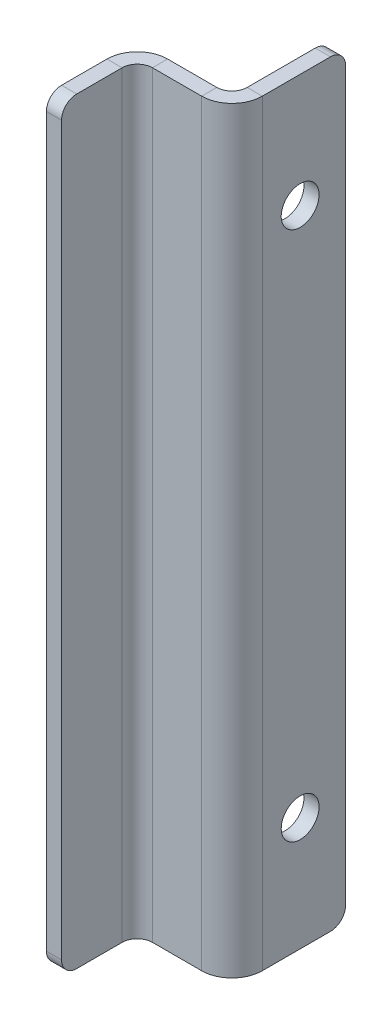
ISO-10303-21;
HEADER;
FILE_DESCRIPTION(('STEP AP214'),'2;1');
FILE_NAME('part.step','',(''),(''),'','','');
FILE_SCHEMA(('AUTOMOTIVE_DESIGN { 1 0 10303 214 1 1 1 1 }'));
ENDSEC;
DATA;
#1=APPLICATION_CONTEXT('core data for automotive mechanical design processes');
#2=APPLICATION_PROTOCOL_DEFINITION('international standard','automotive_design',2000,#1);
#3=PRODUCT_CONTEXT('',#1,'mechanical');
#4=PRODUCT('Part','Part','',(#3));
#5=PRODUCT_RELATED_PRODUCT_CATEGORY('part','',(#4));
#6=PRODUCT_DEFINITION_FORMATION('','',#4);
#7=PRODUCT_DEFINITION_CONTEXT('part definition',#1,'design');
#8=PRODUCT_DEFINITION('design','',#6,#7);
#9=PRODUCT_DEFINITION_SHAPE('','',#8);
#10=(LENGTH_UNIT() NAMED_UNIT(*) SI_UNIT(.MILLI.,.METRE.));
#11=(NAMED_UNIT(*) PLANE_ANGLE_UNIT() SI_UNIT($,.RADIAN.));
#12=(NAMED_UNIT(*) SI_UNIT($,.STERADIAN.) SOLID_ANGLE_UNIT());
#13=UNCERTAINTY_MEASURE_WITH_UNIT(LENGTH_MEASURE(1.E-05),#10,'distance_accuracy_value','');
#14=(GEOMETRIC_REPRESENTATION_CONTEXT(3) GLOBAL_UNCERTAINTY_ASSIGNED_CONTEXT((#13)) GLOBAL_UNIT_ASSIGNED_CONTEXT((#10,
#11,#12)) REPRESENTATION_CONTEXT('',''));
#15=CARTESIAN_POINT('',(0.,0.,0.));
#16=DIRECTION('',(0.,0.,1.));
#17=DIRECTION('',(1.,0.,0.));
#18=AXIS2_PLACEMENT_3D('',#15,#16,#17);
#19=CARTESIAN_POINT('',(0.,50.,-8.));
#20=DIRECTION('',(0.,1.,0.));
#21=DIRECTION('',(0.,0.,1.));
#22=AXIS2_PLACEMENT_3D('',#19,#20,#21);
#23=PLANE('',#22);
#24=DIRECTION('',(-1.,0.,0.));
#25=VECTOR('',#24,1.);
#26=CARTESIAN_POINT('',(0.,50.,-8.));
#27=LINE('',#26,#25);
#28=CARTESIAN_POINT('',(0.,50.,-8.));
#29=VERTEX_POINT('',#28);
#30=CARTESIAN_POINT('',(-2.,50.,-8.));
#31=VERTEX_POINT('',#30);
#32=EDGE_CURVE('E288',#29,#31,#27,.T.);
#33=ORIENTED_EDGE('',*,*,#32,.F.);
#34=CARTESIAN_POINT('',(2.,50.,-8.));
#35=DIRECTION('',(0.,1.,0.));
#36=DIRECTION('',(0.,0.,1.));
#37=AXIS2_PLACEMENT_3D('',#34,#35,#36);
#38=CIRCLE('',#37,2.);
#39=CARTESIAN_POINT('',(2.,50.,-10.));
#40=VERTEX_POINT('',#39);
#41=EDGE_CURVE('E208',#29,#40,#38,.F.);
#42=ORIENTED_EDGE('',*,*,#41,.T.);
#43=DIRECTION('',(0.,0.,1.));
#44=VECTOR('',#43,1.);
#45=CARTESIAN_POINT('',(2.,50.,-12.));
#46=LINE('',#45,#44);
#47=CARTESIAN_POINT('',(2.,50.,-12.));
#48=VERTEX_POINT('',#47);
#49=EDGE_CURVE('E286',#48,#40,#46,.T.);
#50=ORIENTED_EDGE('',*,*,#49,.F.);
#51=CARTESIAN_POINT('',(2.,50.,-8.));
#52=DIRECTION('',(0.,1.,0.));
#53=DIRECTION('',(-1.,0.,0.));
#54=AXIS2_PLACEMENT_3D('',#51,#52,#53);
#55=CIRCLE('',#54,4.);
#56=EDGE_CURVE('E198',#31,#48,#55,.F.);
#57=ORIENTED_EDGE('',*,*,#56,.F.);
#58=EDGE_LOOP('',(#33,#42,#50,#57));
#59=FACE_BOUND('',#58,.T.);
#60=ADVANCED_FACE('F40',(#59),#23,.T.);
#61=CARTESIAN_POINT('',(2.,50.,-12.));
#62=DIRECTION('',(0.,1.,0.));
#63=DIRECTION('',(0.,0.,1.));
#64=AXIS2_PLACEMENT_3D('',#61,#62,#63);
#65=PLANE('',#64);
#66=DIRECTION('',(0.,0.,-1.));
#67=VECTOR('',#66,1.);
#68=CARTESIAN_POINT('',(-2.,50.,0.));
#69=LINE('',#68,#67);
#70=CARTESIAN_POINT('',(-2.,50.,-2.));
#71=VERTEX_POINT('',#70);
#72=EDGE_CURVE('E204',#71,#31,#69,.T.);
#73=ORIENTED_EDGE('',*,*,#72,.F.);
#74=DIRECTION('',(-1.,0.,0.));
#75=VECTOR('',#74,1.);
#76=CARTESIAN_POINT('',(2.,50.,-2.));
#77=LINE('',#76,#75);
#78=CARTESIAN_POINT('',(0.,50.,-2.));
#79=VERTEX_POINT('',#78);
#80=EDGE_CURVE('E63',#71,#79,#77,.F.);
#81=ORIENTED_EDGE('',*,*,#80,.T.);
#82=DIRECTION('',(0.,0.,-1.));
#83=VECTOR('',#82,1.);
#84=CARTESIAN_POINT('',(0.,50.,0.));
#85=LINE('',#84,#83);
#86=EDGE_CURVE('E206',#79,#29,#85,.T.);
#87=ORIENTED_EDGE('',*,*,#86,.T.);
#88=ORIENTED_EDGE('',*,*,#32,.T.);
#89=EDGE_LOOP('',(#73,#81,#87,#88));
#90=FACE_BOUND('',#89,.T.);
#91=ADVANCED_FACE('F331',(#90),#65,.T.);
#92=CARTESIAN_POINT('',(2.,-50.,-10.));
#93=DIRECTION('',(0.,-1.,0.));
#94=DIRECTION('',(0.,0.,-1.));
#95=AXIS2_PLACEMENT_3D('',#92,#93,#94);
#96=PLANE('',#95);
#97=DIRECTION('',(0.,0.,-1.));
#98=VECTOR('',#97,1.);
#99=CARTESIAN_POINT('',(2.,-50.,-10.));
#100=LINE('',#99,#98);
#101=CARTESIAN_POINT('',(2.,-50.,-10.));
#102=VERTEX_POINT('',#101);
#103=CARTESIAN_POINT('',(2.,-50.,-12.));
#104=VERTEX_POINT('',#103);
#105=EDGE_CURVE('E284',#102,#104,#100,.T.);
#106=ORIENTED_EDGE('',*,*,#105,.F.);
#107=CARTESIAN_POINT('',(2.,-50.,-8.));
#108=DIRECTION('',(0.,1.,0.));
#109=DIRECTION('',(0.,0.,1.));
#110=AXIS2_PLACEMENT_3D('',#107,#108,#109);
#111=CIRCLE('',#110,2.);
#112=CARTESIAN_POINT('',(0.,-50.,-8.));
#113=VERTEX_POINT('',#112);
#114=EDGE_CURVE('E233',#113,#102,#111,.F.);
#115=ORIENTED_EDGE('',*,*,#114,.F.);
#116=DIRECTION('',(1.,0.,0.));
#117=VECTOR('',#116,1.);
#118=CARTESIAN_POINT('',(-2.,-50.,-8.));
#119=LINE('',#118,#117);
#120=CARTESIAN_POINT('',(-2.,-50.,-8.));
#121=VERTEX_POINT('',#120);
#122=EDGE_CURVE('E281',#121,#113,#119,.T.);
#123=ORIENTED_EDGE('',*,*,#122,.F.);
#124=CARTESIAN_POINT('',(2.,-50.,-8.));
#125=DIRECTION('',(0.,1.,0.));
#126=DIRECTION('',(-1.,0.,0.));
#127=AXIS2_PLACEMENT_3D('',#124,#125,#126);
#128=CIRCLE('',#127,4.);
#129=EDGE_CURVE('E226',#121,#104,#128,.F.);
#130=ORIENTED_EDGE('',*,*,#129,.T.);
#131=EDGE_LOOP('',(#106,#115,#123,#130));
#132=FACE_BOUND('',#131,.T.);
#133=ADVANCED_FACE('F412',(#132),#96,.T.);
#134=CARTESIAN_POINT('',(-2.,-50.,-8.));
#135=DIRECTION('',(0.,-1.,0.));
#136=DIRECTION('',(0.,0.,-1.));
#137=AXIS2_PLACEMENT_3D('',#134,#135,#136);
#138=PLANE('',#137);
#139=DIRECTION('',(1.,0.,0.));
#140=VECTOR('',#139,1.);
#141=CARTESIAN_POINT('',(0.,-50.,-10.));
#142=LINE('',#141,#140);
#143=CARTESIAN_POINT('',(8.5,-50.,-10.));
#144=VERTEX_POINT('',#143);
#145=EDGE_CURVE('E236',#102,#144,#142,.T.);
#146=ORIENTED_EDGE('',*,*,#145,.F.);
#147=ORIENTED_EDGE('',*,*,#105,.T.);
#148=DIRECTION('',(1.,0.,0.));
#149=VECTOR('',#148,1.);
#150=CARTESIAN_POINT('',(0.,-50.,-12.));
#151=LINE('',#150,#149);
#152=CARTESIAN_POINT('',(8.5,-50.,-12.));
#153=VERTEX_POINT('',#152);
#154=EDGE_CURVE('E223',#104,#153,#151,.T.);
#155=ORIENTED_EDGE('',*,*,#154,.T.);
#156=DIRECTION('',(0.,0.,1.));
#157=VECTOR('',#156,1.);
#158=CARTESIAN_POINT('',(8.5,-50.,-12.));
#159=LINE('',#158,#157);
#160=EDGE_CURVE('E277',#153,#144,#159,.T.);
#161=ORIENTED_EDGE('',*,*,#160,.T.);
#162=EDGE_LOOP('',(#146,#147,#155,#161));
#163=FACE_BOUND('',#162,.T.);
#164=ADVANCED_FACE('F435',(#163),#138,.T.);
#165=CARTESIAN_POINT('',(8.5,50.,-10.));
#166=DIRECTION('',(0.,1.,0.));
#167=DIRECTION('',(0.,0.,1.));
#168=AXIS2_PLACEMENT_3D('',#165,#166,#167);
#169=PLANE('',#168);
#170=DIRECTION('',(0.,0.,-1.));
#171=VECTOR('',#170,1.);
#172=CARTESIAN_POINT('',(8.5,50.,-10.));
#173=LINE('',#172,#171);
#174=CARTESIAN_POINT('',(8.5,50.,-10.));
#175=VERTEX_POINT('',#174);
#176=CARTESIAN_POINT('',(8.5,50.,-12.));
#177=VERTEX_POINT('',#176);
#178=EDGE_CURVE('E167',#175,#177,#173,.T.);
#179=ORIENTED_EDGE('',*,*,#178,.F.);
#180=CARTESIAN_POINT('',(8.5,50.,-14.));
#181=DIRECTION('',(0.,-1.,0.));
#182=DIRECTION('',(0.,0.,-1.));
#183=AXIS2_PLACEMENT_3D('',#180,#181,#182);
#184=CIRCLE('',#183,4.);
#185=CARTESIAN_POINT('',(12.5,50.,-14.));
#186=VERTEX_POINT('',#185);
#187=EDGE_CURVE('E162',#175,#186,#184,.F.);
#188=ORIENTED_EDGE('',*,*,#187,.T.);
#189=DIRECTION('',(1.,0.,0.));
#190=VECTOR('',#189,1.);
#191=CARTESIAN_POINT('',(10.5,50.,-14.));
#192=LINE('',#191,#190);
#193=CARTESIAN_POINT('',(10.5,50.,-14.));
#194=VERTEX_POINT('',#193);
#195=EDGE_CURVE('E155',#194,#186,#192,.T.);
#196=ORIENTED_EDGE('',*,*,#195,.F.);
#197=CARTESIAN_POINT('',(8.5,50.,-14.));
#198=DIRECTION('',(0.,1.,0.));
#199=DIRECTION('',(-1.,0.,0.));
#200=AXIS2_PLACEMENT_3D('',#197,#198,#199);
#201=CIRCLE('',#200,2.);
#202=EDGE_CURVE('E159',#177,#194,#201,.T.);
#203=ORIENTED_EDGE('',*,*,#202,.F.);
#204=EDGE_LOOP('',(#179,#188,#196,#203));
#205=FACE_BOUND('',#204,.T.);
#206=ADVANCED_FACE('F157',(#205),#169,.T.);
#207=CARTESIAN_POINT('',(10.5,50.,-14.));
#208=DIRECTION('',(0.,1.,0.));
#209=DIRECTION('',(0.,0.,1.));
#210=AXIS2_PLACEMENT_3D('',#207,#208,#209);
#211=PLANE('',#210);
#212=DIRECTION('',(1.,0.,0.));
#213=VECTOR('',#212,1.);
#214=CARTESIAN_POINT('',(0.,50.,-10.));
#215=LINE('',#214,#213);
#216=EDGE_CURVE('E211',#40,#175,#215,.T.);
#217=ORIENTED_EDGE('',*,*,#216,.T.);
#218=ORIENTED_EDGE('',*,*,#178,.T.);
#219=DIRECTION('',(1.,0.,0.));
#220=VECTOR('',#219,1.);
#221=CARTESIAN_POINT('',(0.,50.,-12.));
#222=LINE('',#221,#220);
#223=EDGE_CURVE('E196',#48,#177,#222,.T.);
#224=ORIENTED_EDGE('',*,*,#223,.F.);
#225=ORIENTED_EDGE('',*,*,#49,.T.);
#226=EDGE_LOOP('',(#217,#218,#224,#225));
#227=FACE_BOUND('',#226,.T.);
#228=ADVANCED_FACE('F348',(#227),#211,.T.);
#229=CARTESIAN_POINT('',(12.5,-50.,-14.));
#230=DIRECTION('',(0.,-1.,0.));
#231=DIRECTION('',(0.,0.,-1.));
#232=AXIS2_PLACEMENT_3D('',#229,#230,#231);
#233=PLANE('',#232);
#234=DIRECTION('',(-1.,0.,0.));
#235=VECTOR('',#234,1.);
#236=CARTESIAN_POINT('',(12.5,-50.,-14.));
#237=LINE('',#236,#235);
#238=CARTESIAN_POINT('',(12.5,-50.,-14.));
#239=VERTEX_POINT('',#238);
#240=CARTESIAN_POINT('',(10.5,-50.,-14.));
#241=VERTEX_POINT('',#240);
#242=EDGE_CURVE('E168',#239,#241,#237,.T.);
#243=ORIENTED_EDGE('',*,*,#242,.F.);
#244=CARTESIAN_POINT('',(8.5,-50.,-14.));
#245=DIRECTION('',(0.,-1.,0.));
#246=DIRECTION('',(0.,0.,-1.));
#247=AXIS2_PLACEMENT_3D('',#244,#245,#246);
#248=CIRCLE('',#247,4.);
#249=EDGE_CURVE('E239',#144,#239,#248,.F.);
#250=ORIENTED_EDGE('',*,*,#249,.F.);
#251=ORIENTED_EDGE('',*,*,#160,.F.);
#252=CARTESIAN_POINT('',(8.5,-50.,-14.));
#253=DIRECTION('',(0.,1.,0.));
#254=DIRECTION('',(-1.,0.,0.));
#255=AXIS2_PLACEMENT_3D('',#252,#253,#254);
#256=CIRCLE('',#255,2.);
#257=EDGE_CURVE('E221',#153,#241,#256,.T.);
#258=ORIENTED_EDGE('',*,*,#257,.T.);
#259=EDGE_LOOP('',(#243,#250,#251,#258));
#260=FACE_BOUND('',#259,.T.);
#261=ADVANCED_FACE('F437',(#260),#233,.T.);
#262=CARTESIAN_POINT('',(8.5,-50.,-12.));
#263=DIRECTION('',(0.,-1.,0.));
#264=DIRECTION('',(0.,0.,-1.));
#265=AXIS2_PLACEMENT_3D('',#262,#263,#264);
#266=PLANE('',#265);
#267=DIRECTION('',(0.,0.,-1.));
#268=VECTOR('',#267,1.);
#269=CARTESIAN_POINT('',(10.5,-50.,-10.));
#270=LINE('',#269,#268);
#271=CARTESIAN_POINT('',(10.5,-50.,-23.));
#272=VERTEX_POINT('',#271);
#273=EDGE_CURVE('E180',#241,#272,#270,.T.);
#274=ORIENTED_EDGE('',*,*,#273,.T.);
#275=DIRECTION('',(1.,0.,0.));
#276=VECTOR('',#275,1.);
#277=CARTESIAN_POINT('',(8.5,-50.,-23.));
#278=LINE('',#277,#276);
#279=CARTESIAN_POINT('',(12.5,-50.,-23.));
#280=VERTEX_POINT('',#279);
#281=EDGE_CURVE('E291',#272,#280,#278,.T.);
#282=ORIENTED_EDGE('',*,*,#281,.T.);
#283=DIRECTION('',(0.,0.,-1.));
#284=VECTOR('',#283,1.);
#285=CARTESIAN_POINT('',(12.5,-50.,-10.));
#286=LINE('',#285,#284);
#287=EDGE_CURVE('E216',#239,#280,#286,.T.);
#288=ORIENTED_EDGE('',*,*,#287,.F.);
#289=ORIENTED_EDGE('',*,*,#242,.T.);
#290=EDGE_LOOP('',(#274,#282,#288,#289));
#291=FACE_BOUND('',#290,.T.);
#292=ADVANCED_FACE('F392',(#291),#266,.T.);
#293=CARTESIAN_POINT('',(12.5,50.,-10.));
#294=DIRECTION('',(-1.,0.,0.));
#295=DIRECTION('',(0.,0.,1.));
#296=AXIS2_PLACEMENT_3D('',#293,#294,#295);
#297=PLANE('',#296);
#298=CARTESIAN_POINT('',(12.5,35.,-19.));
#299=DIRECTION('',(1.,0.,0.));
#300=DIRECTION('',(0.,0.,-1.));
#301=AXIS2_PLACEMENT_3D('',#298,#299,#300);
#302=CIRCLE('',#301,2.50000000000001);
#303=CARTESIAN_POINT('',(12.5,35.,-21.5));
#304=VERTEX_POINT('',#303);
#305=EDGE_CURVE('E370',#304,#304,#302,.T.);
#306=ORIENTED_EDGE('',*,*,#305,.F.);
#307=EDGE_LOOP('',(#306));
#308=FACE_BOUND('',#307,.T.);
#309=CARTESIAN_POINT('',(12.5,-35.,-19.));
#310=DIRECTION('',(1.,0.,0.));
#311=DIRECTION('',(0.,0.,1.));
#312=AXIS2_PLACEMENT_3D('',#309,#310,#311);
#313=CIRCLE('',#312,2.5);
#314=CARTESIAN_POINT('',(12.5,-35.,-16.5));
#315=VERTEX_POINT('',#314);
#316=EDGE_CURVE('E363',#315,#315,#313,.T.);
#317=ORIENTED_EDGE('',*,*,#316,.F.);
#318=EDGE_LOOP('',(#317));
#319=FACE_BOUND('',#318,.T.);
#320=ORIENTED_EDGE('',*,*,#287,.T.);
#321=CARTESIAN_POINT('',(12.5,-48.,-23.));
#322=DIRECTION('',(-1.,0.,0.));
#323=DIRECTION('',(0.,0.,1.));
#324=AXIS2_PLACEMENT_3D('',#321,#322,#323);
#325=CIRCLE('',#324,2.);
#326=CARTESIAN_POINT('',(12.5,-48.,-25.));
#327=VERTEX_POINT('',#326);
#328=EDGE_CURVE('E296',#280,#327,#325,.F.);
#329=ORIENTED_EDGE('',*,*,#328,.T.);
#330=DIRECTION('',(0.,-1.,0.));
#331=VECTOR('',#330,1.);
#332=CARTESIAN_POINT('',(12.5,50.,-25.));
#333=LINE('',#332,#331);
#334=CARTESIAN_POINT('',(12.5,48.,-25.));
#335=VERTEX_POINT('',#334);
#336=EDGE_CURVE('E273',#335,#327,#333,.T.);
#337=ORIENTED_EDGE('',*,*,#336,.F.);
#338=CARTESIAN_POINT('',(12.5,48.,-23.));
#339=DIRECTION('',(-1.,0.,0.));
#340=DIRECTION('',(0.,0.,1.));
#341=AXIS2_PLACEMENT_3D('',#338,#339,#340);
#342=CIRCLE('',#341,2.);
#343=CARTESIAN_POINT('',(12.5,50.,-23.));
#344=VERTEX_POINT('',#343);
#345=EDGE_CURVE('E294',#335,#344,#342,.F.);
#346=ORIENTED_EDGE('',*,*,#345,.T.);
#347=DIRECTION('',(0.,0.,-1.));
#348=VECTOR('',#347,1.);
#349=CARTESIAN_POINT('',(12.5,50.,-10.));
#350=LINE('',#349,#348);
#351=EDGE_CURVE('E191',#186,#344,#350,.T.);
#352=ORIENTED_EDGE('',*,*,#351,.F.);
#353=DIRECTION('',(0.,-1.,0.));
#354=VECTOR('',#353,1.);
#355=CARTESIAN_POINT('',(12.5,50.,-14.));
#356=LINE('',#355,#354);
#357=EDGE_CURVE('E215',#186,#239,#356,.T.);
#358=ORIENTED_EDGE('',*,*,#357,.T.);
#359=EDGE_LOOP('',(#320,#329,#337,#346,#352,#358));
#360=FACE_BOUND('',#359,.T.);
#361=ADVANCED_FACE('F360',(#308,#319,#360),#297,.F.);
#362=CARTESIAN_POINT('',(10.5,50.,-25.));
#363=DIRECTION('',(0.,0.,-1.));
#364=DIRECTION('',(-1.,0.,0.));
#365=AXIS2_PLACEMENT_3D('',#362,#363,#364);
#366=PLANE('',#365);
#367=ORIENTED_EDGE('',*,*,#336,.T.);
#368=DIRECTION('',(1.,0.,0.));
#369=VECTOR('',#368,1.);
#370=CARTESIAN_POINT('',(10.5,-48.,-25.));
#371=LINE('',#370,#369);
#372=CARTESIAN_POINT('',(10.5,-48.,-25.));
#373=VERTEX_POINT('',#372);
#374=EDGE_CURVE('E301',#327,#373,#371,.F.);
#375=ORIENTED_EDGE('',*,*,#374,.T.);
#376=DIRECTION('',(0.,-1.,0.));
#377=VECTOR('',#376,1.);
#378=CARTESIAN_POINT('',(10.5,50.,-25.));
#379=LINE('',#378,#377);
#380=CARTESIAN_POINT('',(10.5,48.,-25.));
#381=VERTEX_POINT('',#380);
#382=EDGE_CURVE('E185',#381,#373,#379,.T.);
#383=ORIENTED_EDGE('',*,*,#382,.F.);
#384=DIRECTION('',(1.,0.,0.));
#385=VECTOR('',#384,1.);
#386=CARTESIAN_POINT('',(10.5,48.,-25.));
#387=LINE('',#386,#385);
#388=EDGE_CURVE('E298',#381,#335,#387,.T.);
#389=ORIENTED_EDGE('',*,*,#388,.T.);
#390=EDGE_LOOP('',(#367,#375,#383,#389));
#391=FACE_BOUND('',#390,.T.);
#392=ADVANCED_FACE('F391',(#391),#366,.T.);
#393=CARTESIAN_POINT('',(10.5,50.,-10.));
#394=DIRECTION('',(-1.,0.,0.));
#395=DIRECTION('',(0.,0.,1.));
#396=AXIS2_PLACEMENT_3D('',#393,#394,#395);
#397=PLANE('',#396);
#398=CARTESIAN_POINT('',(10.5,35.,-19.));
#399=DIRECTION('',(1.,0.,0.));
#400=DIRECTION('',(0.,0.,-1.));
#401=AXIS2_PLACEMENT_3D('',#398,#399,#400);
#402=CIRCLE('',#401,2.50000000000001);
#403=CARTESIAN_POINT('',(10.5,35.,-21.5));
#404=VERTEX_POINT('',#403);
#405=EDGE_CURVE('E366',#404,#404,#402,.T.);
#406=ORIENTED_EDGE('',*,*,#405,.T.);
#407=EDGE_LOOP('',(#406));
#408=FACE_BOUND('',#407,.T.);
#409=CARTESIAN_POINT('',(10.5,-35.,-19.));
#410=DIRECTION('',(1.,0.,0.));
#411=DIRECTION('',(0.,0.,1.));
#412=AXIS2_PLACEMENT_3D('',#409,#410,#411);
#413=CIRCLE('',#412,2.5);
#414=CARTESIAN_POINT('',(10.5,-35.,-16.5));
#415=VERTEX_POINT('',#414);
#416=EDGE_CURVE('E219',#415,#415,#413,.T.);
#417=ORIENTED_EDGE('',*,*,#416,.T.);
#418=EDGE_LOOP('',(#417));
#419=FACE_BOUND('',#418,.T.);
#420=ORIENTED_EDGE('',*,*,#382,.T.);
#421=CARTESIAN_POINT('',(10.5,-48.,-23.));
#422=DIRECTION('',(-1.,0.,0.));
#423=DIRECTION('',(0.,0.,1.));
#424=AXIS2_PLACEMENT_3D('',#421,#422,#423);
#425=CIRCLE('',#424,2.);
#426=EDGE_CURVE('E305',#373,#272,#425,.T.);
#427=ORIENTED_EDGE('',*,*,#426,.T.);
#428=ORIENTED_EDGE('',*,*,#273,.F.);
#429=DIRECTION('',(0.,-1.,0.));
#430=VECTOR('',#429,1.);
#431=CARTESIAN_POINT('',(10.5,50.,-14.));
#432=LINE('',#431,#430);
#433=EDGE_CURVE('E174',#194,#241,#432,.T.);
#434=ORIENTED_EDGE('',*,*,#433,.F.);
#435=DIRECTION('',(0.,0.,-1.));
#436=VECTOR('',#435,1.);
#437=CARTESIAN_POINT('',(10.5,50.,-10.));
#438=LINE('',#437,#436);
#439=CARTESIAN_POINT('',(10.5,50.,-23.));
#440=VERTEX_POINT('',#439);
#441=EDGE_CURVE('E177',#194,#440,#438,.T.);
#442=ORIENTED_EDGE('',*,*,#441,.T.);
#443=CARTESIAN_POINT('',(10.5,48.,-23.));
#444=DIRECTION('',(-1.,0.,0.));
#445=DIRECTION('',(0.,0.,1.));
#446=AXIS2_PLACEMENT_3D('',#443,#444,#445);
#447=CIRCLE('',#446,2.);
#448=EDGE_CURVE('E303',#440,#381,#447,.T.);
#449=ORIENTED_EDGE('',*,*,#448,.T.);
#450=EDGE_LOOP('',(#420,#427,#428,#434,#442,#449));
#451=FACE_BOUND('',#450,.T.);
#452=ADVANCED_FACE('F176',(#408,#419,#451),#397,.T.);
#453=CARTESIAN_POINT('',(8.5,50.,-14.));
#454=DIRECTION('',(0.,-1.,0.));
#455=DIRECTION('',(0.,0.,-1.));
#456=AXIS2_PLACEMENT_3D('',#453,#454,#455);
#457=CYLINDRICAL_SURFACE('',#456,2.);
#458=ORIENTED_EDGE('',*,*,#257,.F.);
#459=DIRECTION('',(0.,-1.,0.));
#460=VECTOR('',#459,1.);
#461=CARTESIAN_POINT('',(8.5,50.,-12.));
#462=LINE('',#461,#460);
#463=EDGE_CURVE('E186',#177,#153,#462,.T.);
#464=ORIENTED_EDGE('',*,*,#463,.F.);
#465=ORIENTED_EDGE('',*,*,#202,.T.);
#466=ORIENTED_EDGE('',*,*,#433,.T.);
#467=EDGE_LOOP('',(#458,#464,#465,#466));
#468=FACE_BOUND('',#467,.T.);
#469=ADVANCED_FACE('F194',(#468),#457,.F.);
#470=CARTESIAN_POINT('',(0.,50.,-12.));
#471=DIRECTION('',(0.,0.,-1.));
#472=DIRECTION('',(-1.,0.,0.));
#473=AXIS2_PLACEMENT_3D('',#470,#471,#472);
#474=PLANE('',#473);
#475=ORIENTED_EDGE('',*,*,#154,.F.);
#476=DIRECTION('',(0.,-1.,0.));
#477=VECTOR('',#476,1.);
#478=CARTESIAN_POINT('',(2.,50.,-12.));
#479=LINE('',#478,#477);
#480=EDGE_CURVE('E266',#48,#104,#479,.T.);
#481=ORIENTED_EDGE('',*,*,#480,.F.);
#482=ORIENTED_EDGE('',*,*,#223,.T.);
#483=ORIENTED_EDGE('',*,*,#463,.T.);
#484=EDGE_LOOP('',(#475,#481,#482,#483));
#485=FACE_BOUND('',#484,.T.);
#486=ADVANCED_FACE('F347',(#485),#474,.T.);
#487=CARTESIAN_POINT('',(2.,50.,-8.));
#488=DIRECTION('',(0.,-1.,0.));
#489=DIRECTION('',(0.,0.,-1.));
#490=AXIS2_PLACEMENT_3D('',#487,#488,#489);
#491=CYLINDRICAL_SURFACE('',#490,4.);
#492=ORIENTED_EDGE('',*,*,#129,.F.);
#493=DIRECTION('',(0.,-1.,0.));
#494=VECTOR('',#493,1.);
#495=CARTESIAN_POINT('',(-2.,50.,-8.));
#496=LINE('',#495,#494);
#497=EDGE_CURVE('E262',#31,#121,#496,.T.);
#498=ORIENTED_EDGE('',*,*,#497,.F.);
#499=ORIENTED_EDGE('',*,*,#56,.T.);
#500=ORIENTED_EDGE('',*,*,#480,.T.);
#501=EDGE_LOOP('',(#492,#498,#499,#500));
#502=FACE_BOUND('',#501,.T.);
#503=ADVANCED_FACE('F338',(#502),#491,.T.);
#504=CARTESIAN_POINT('',(-2.,50.,0.));
#505=DIRECTION('',(-1.,0.,0.));
#506=DIRECTION('',(0.,0.,1.));
#507=AXIS2_PLACEMENT_3D('',#504,#505,#506);
#508=PLANE('',#507);
#509=DIRECTION('',(0.,-1.,0.));
#510=VECTOR('',#509,1.);
#511=CARTESIAN_POINT('',(-2.,50.,0.));
#512=LINE('',#511,#510);
#513=CARTESIAN_POINT('',(-2.,48.,0.));
#514=VERTEX_POINT('',#513);
#515=CARTESIAN_POINT('',(-2.,-48.,0.));
#516=VERTEX_POINT('',#515);
#517=EDGE_CURVE('E258',#514,#516,#512,.T.);
#518=ORIENTED_EDGE('',*,*,#517,.F.);
#519=CARTESIAN_POINT('',(-2.,48.,-2.));
#520=DIRECTION('',(-1.,0.,0.));
#521=DIRECTION('',(0.,0.,1.));
#522=AXIS2_PLACEMENT_3D('',#519,#520,#521);
#523=CIRCLE('',#522,2.);
#524=EDGE_CURVE('E315',#514,#71,#523,.T.);
#525=ORIENTED_EDGE('',*,*,#524,.T.);
#526=ORIENTED_EDGE('',*,*,#72,.T.);
#527=ORIENTED_EDGE('',*,*,#497,.T.);
#528=DIRECTION('',(0.,0.,-1.));
#529=VECTOR('',#528,1.);
#530=CARTESIAN_POINT('',(-2.,-50.,0.));
#531=LINE('',#530,#529);
#532=CARTESIAN_POINT('',(-2.,-50.,-2.));
#533=VERTEX_POINT('',#532);
#534=EDGE_CURVE('E229',#533,#121,#531,.T.);
#535=ORIENTED_EDGE('',*,*,#534,.F.);
#536=CARTESIAN_POINT('',(-2.,-48.,-2.));
#537=DIRECTION('',(-1.,0.,0.));
#538=DIRECTION('',(0.,0.,1.));
#539=AXIS2_PLACEMENT_3D('',#536,#537,#538);
#540=CIRCLE('',#539,2.);
#541=EDGE_CURVE('E313',#533,#516,#540,.T.);
#542=ORIENTED_EDGE('',*,*,#541,.T.);
#543=EDGE_LOOP('',(#518,#525,#526,#527,#535,#542));
#544=FACE_BOUND('',#543,.T.);
#545=ADVANCED_FACE('F330',(#544),#508,.T.);
#546=CARTESIAN_POINT('',(0.,50.,0.));
#547=DIRECTION('',(0.,0.,1.));
#548=DIRECTION('',(1.,0.,0.));
#549=AXIS2_PLACEMENT_3D('',#546,#547,#548);
#550=PLANE('',#549);
#551=DIRECTION('',(0.,-1.,0.));
#552=VECTOR('',#551,1.);
#553=CARTESIAN_POINT('',(0.,50.,0.));
#554=LINE('',#553,#552);
#555=CARTESIAN_POINT('',(0.,48.,0.));
#556=VERTEX_POINT('',#555);
#557=CARTESIAN_POINT('',(0.,-48.,0.));
#558=VERTEX_POINT('',#557);
#559=EDGE_CURVE('E255',#556,#558,#554,.T.);
#560=ORIENTED_EDGE('',*,*,#559,.F.);
#561=DIRECTION('',(-1.,0.,0.));
#562=VECTOR('',#561,1.);
#563=CARTESIAN_POINT('',(0.,48.,0.));
#564=LINE('',#563,#562);
#565=EDGE_CURVE('E310',#556,#514,#564,.T.);
#566=ORIENTED_EDGE('',*,*,#565,.T.);
#567=ORIENTED_EDGE('',*,*,#517,.T.);
#568=DIRECTION('',(-1.,0.,0.));
#569=VECTOR('',#568,1.);
#570=CARTESIAN_POINT('',(0.,-48.,0.));
#571=LINE('',#570,#569);
#572=EDGE_CURVE('E308',#516,#558,#571,.F.);
#573=ORIENTED_EDGE('',*,*,#572,.T.);
#574=EDGE_LOOP('',(#560,#566,#567,#573));
#575=FACE_BOUND('',#574,.T.);
#576=ADVANCED_FACE('F325',(#575),#550,.T.);
#577=CARTESIAN_POINT('',(0.,50.,0.));
#578=DIRECTION('',(-1.,0.,0.));
#579=DIRECTION('',(0.,0.,1.));
#580=AXIS2_PLACEMENT_3D('',#577,#578,#579);
#581=PLANE('',#580);
#582=ORIENTED_EDGE('',*,*,#86,.F.);
#583=CARTESIAN_POINT('',(0.,48.,-2.));
#584=DIRECTION('',(-1.,0.,0.));
#585=DIRECTION('',(0.,0.,1.));
#586=AXIS2_PLACEMENT_3D('',#583,#584,#585);
#587=CIRCLE('',#586,2.);
#588=EDGE_CURVE('E48',#79,#556,#587,.F.);
#589=ORIENTED_EDGE('',*,*,#588,.T.);
#590=ORIENTED_EDGE('',*,*,#559,.T.);
#591=CARTESIAN_POINT('',(0.,-48.,-2.));
#592=DIRECTION('',(-1.,0.,0.));
#593=DIRECTION('',(0.,0.,1.));
#594=AXIS2_PLACEMENT_3D('',#591,#592,#593);
#595=CIRCLE('',#594,2.);
#596=CARTESIAN_POINT('',(0.,-50.,-2.));
#597=VERTEX_POINT('',#596);
#598=EDGE_CURVE('E55',#558,#597,#595,.F.);
#599=ORIENTED_EDGE('',*,*,#598,.T.);
#600=DIRECTION('',(0.,0.,-1.));
#601=VECTOR('',#600,1.);
#602=CARTESIAN_POINT('',(0.,-50.,0.));
#603=LINE('',#602,#601);
#604=EDGE_CURVE('E231',#597,#113,#603,.T.);
#605=ORIENTED_EDGE('',*,*,#604,.T.);
#606=DIRECTION('',(0.,-1.,0.));
#607=VECTOR('',#606,1.);
#608=CARTESIAN_POINT('',(0.,50.,-8.));
#609=LINE('',#608,#607);
#610=EDGE_CURVE('E251',#29,#113,#609,.T.);
#611=ORIENTED_EDGE('',*,*,#610,.F.);
#612=EDGE_LOOP('',(#582,#589,#590,#599,#605,#611));
#613=FACE_BOUND('',#612,.T.);
#614=ADVANCED_FACE('F320',(#613),#581,.F.);
#615=CARTESIAN_POINT('',(2.,50.,-8.));
#616=DIRECTION('',(0.,-1.,0.));
#617=DIRECTION('',(0.,0.,-1.));
#618=AXIS2_PLACEMENT_3D('',#615,#616,#617);
#619=CYLINDRICAL_SURFACE('',#618,2.);
#620=ORIENTED_EDGE('',*,*,#114,.T.);
#621=DIRECTION('',(0.,-1.,0.));
#622=VECTOR('',#621,1.);
#623=CARTESIAN_POINT('',(2.,50.,-10.));
#624=LINE('',#623,#622);
#625=EDGE_CURVE('E247',#40,#102,#624,.T.);
#626=ORIENTED_EDGE('',*,*,#625,.F.);
#627=ORIENTED_EDGE('',*,*,#41,.F.);
#628=ORIENTED_EDGE('',*,*,#610,.T.);
#629=EDGE_LOOP('',(#620,#626,#627,#628));
#630=FACE_BOUND('',#629,.T.);
#631=ADVANCED_FACE('F433',(#630),#619,.F.);
#632=CARTESIAN_POINT('',(0.,50.,-10.));
#633=DIRECTION('',(0.,0.,-1.));
#634=DIRECTION('',(-1.,0.,0.));
#635=AXIS2_PLACEMENT_3D('',#632,#633,#634);
#636=PLANE('',#635);
#637=ORIENTED_EDGE('',*,*,#145,.T.);
#638=DIRECTION('',(0.,-1.,0.));
#639=VECTOR('',#638,1.);
#640=CARTESIAN_POINT('',(8.5,50.,-10.));
#641=LINE('',#640,#639);
#642=EDGE_CURVE('E244',#175,#144,#641,.T.);
#643=ORIENTED_EDGE('',*,*,#642,.F.);
#644=ORIENTED_EDGE('',*,*,#216,.F.);
#645=ORIENTED_EDGE('',*,*,#625,.T.);
#646=EDGE_LOOP('',(#637,#643,#644,#645));
#647=FACE_BOUND('',#646,.T.);
#648=ADVANCED_FACE('F352',(#647),#636,.F.);
#649=CARTESIAN_POINT('',(8.5,50.,-14.));
#650=DIRECTION('',(0.,-1.,0.));
#651=DIRECTION('',(0.,0.,-1.));
#652=AXIS2_PLACEMENT_3D('',#649,#650,#651);
#653=CYLINDRICAL_SURFACE('',#652,4.);
#654=ORIENTED_EDGE('',*,*,#249,.T.);
#655=ORIENTED_EDGE('',*,*,#357,.F.);
#656=ORIENTED_EDGE('',*,*,#187,.F.);
#657=ORIENTED_EDGE('',*,*,#642,.T.);
#658=EDGE_LOOP('',(#654,#655,#656,#657));
#659=FACE_BOUND('',#658,.T.);
#660=ADVANCED_FACE('F356',(#659),#653,.T.);
#661=CARTESIAN_POINT('',(8.5,50.,-14.));
#662=DIRECTION('',(0.,1.,0.));
#663=DIRECTION('',(-1.,0.,0.));
#664=AXIS2_PLACEMENT_3D('',#661,#662,#663);
#665=PLANE('',#664);
#666=ORIENTED_EDGE('',*,*,#351,.T.);
#667=DIRECTION('',(1.,0.,0.));
#668=VECTOR('',#667,1.);
#669=CARTESIAN_POINT('',(8.5,50.,-23.));
#670=LINE('',#669,#668);
#671=EDGE_CURVE('E190',#344,#440,#670,.F.);
#672=ORIENTED_EDGE('',*,*,#671,.T.);
#673=ORIENTED_EDGE('',*,*,#441,.F.);
#674=ORIENTED_EDGE('',*,*,#195,.T.);
#675=EDGE_LOOP('',(#666,#672,#673,#674));
#676=FACE_BOUND('',#675,.T.);
#677=ADVANCED_FACE('F188',(#676),#665,.T.);
#678=CARTESIAN_POINT('',(8.5,-50.,-14.));
#679=DIRECTION('',(0.,1.,0.));
#680=DIRECTION('',(-1.,0.,0.));
#681=AXIS2_PLACEMENT_3D('',#678,#679,#680);
#682=PLANE('',#681);
#683=ORIENTED_EDGE('',*,*,#604,.F.);
#684=DIRECTION('',(-1.,0.,0.));
#685=VECTOR('',#684,1.);
#686=CARTESIAN_POINT('',(-2.,-50.,-2.));
#687=LINE('',#686,#685);
#688=EDGE_CURVE('E11',#597,#533,#687,.T.);
#689=ORIENTED_EDGE('',*,*,#688,.T.);
#690=ORIENTED_EDGE('',*,*,#534,.T.);
#691=ORIENTED_EDGE('',*,*,#122,.T.);
#692=EDGE_LOOP('',(#683,#689,#690,#691));
#693=FACE_BOUND('',#692,.T.);
#694=ADVANCED_FACE('F397',(#693),#682,.F.);
#695=CARTESIAN_POINT('',(10.5,-35.,-19.));
#696=DIRECTION('',(1.,0.,0.));
#697=DIRECTION('',(0.,0.,-1.));
#698=AXIS2_PLACEMENT_3D('',#695,#696,#697);
#699=CYLINDRICAL_SURFACE('',#698,2.5);
#700=ORIENTED_EDGE('',*,*,#416,.F.);
#701=EDGE_LOOP('',(#700));
#702=FACE_BOUND('',#701,.T.);
#703=ORIENTED_EDGE('',*,*,#316,.T.);
#704=EDGE_LOOP('',(#703));
#705=FACE_BOUND('',#704,.T.);
#706=ADVANCED_FACE('F385',(#702,#705),#699,.F.);
#707=CARTESIAN_POINT('',(10.5,35.,-19.));
#708=DIRECTION('',(1.,0.,0.));
#709=DIRECTION('',(0.,0.,-1.));
#710=AXIS2_PLACEMENT_3D('',#707,#708,#709);
#711=CYLINDRICAL_SURFACE('',#710,2.50000000000001);
#712=ORIENTED_EDGE('',*,*,#405,.F.);
#713=EDGE_LOOP('',(#712));
#714=FACE_BOUND('',#713,.T.);
#715=ORIENTED_EDGE('',*,*,#305,.T.);
#716=EDGE_LOOP('',(#715));
#717=FACE_BOUND('',#716,.T.);
#718=ADVANCED_FACE('F381',(#714,#717),#711,.F.);
#719=CARTESIAN_POINT('',(8.5,-48.,-23.));
#720=DIRECTION('',(1.,0.,0.));
#721=DIRECTION('',(0.,0.,-1.));
#722=AXIS2_PLACEMENT_3D('',#719,#720,#721);
#723=CYLINDRICAL_SURFACE('',#722,2.);
#724=ORIENTED_EDGE('',*,*,#426,.F.);
#725=ORIENTED_EDGE('',*,*,#374,.F.);
#726=ORIENTED_EDGE('',*,*,#328,.F.);
#727=ORIENTED_EDGE('',*,*,#281,.F.);
#728=EDGE_LOOP('',(#724,#725,#726,#727));
#729=FACE_BOUND('',#728,.T.);
#730=ADVANCED_FACE('F384',(#729),#723,.T.);
#731=CARTESIAN_POINT('',(10.5,48.,-23.));
#732=DIRECTION('',(1.,0.,0.));
#733=DIRECTION('',(0.,0.,-1.));
#734=AXIS2_PLACEMENT_3D('',#731,#732,#733);
#735=CYLINDRICAL_SURFACE('',#734,2.);
#736=ORIENTED_EDGE('',*,*,#448,.F.);
#737=ORIENTED_EDGE('',*,*,#671,.F.);
#738=ORIENTED_EDGE('',*,*,#345,.F.);
#739=ORIENTED_EDGE('',*,*,#388,.F.);
#740=EDGE_LOOP('',(#736,#737,#738,#739));
#741=FACE_BOUND('',#740,.T.);
#742=ADVANCED_FACE('F418',(#741),#735,.T.);
#743=CARTESIAN_POINT('',(0.,48.,-2.));
#744=DIRECTION('',(-1.,0.,0.));
#745=DIRECTION('',(0.,0.,1.));
#746=AXIS2_PLACEMENT_3D('',#743,#744,#745);
#747=CYLINDRICAL_SURFACE('',#746,2.);
#748=ORIENTED_EDGE('',*,*,#588,.F.);
#749=ORIENTED_EDGE('',*,*,#80,.F.);
#750=ORIENTED_EDGE('',*,*,#524,.F.);
#751=ORIENTED_EDGE('',*,*,#565,.F.);
#752=EDGE_LOOP('',(#748,#749,#750,#751));
#753=FACE_BOUND('',#752,.T.);
#754=ADVANCED_FACE('F328',(#753),#747,.T.);
#755=CARTESIAN_POINT('',(8.5,-48.,-2.));
#756=DIRECTION('',(1.,0.,0.));
#757=DIRECTION('',(0.,0.,-1.));
#758=AXIS2_PLACEMENT_3D('',#755,#756,#757);
#759=CYLINDRICAL_SURFACE('',#758,2.);
#760=ORIENTED_EDGE('',*,*,#598,.F.);
#761=ORIENTED_EDGE('',*,*,#572,.F.);
#762=ORIENTED_EDGE('',*,*,#541,.F.);
#763=ORIENTED_EDGE('',*,*,#688,.F.);
#764=EDGE_LOOP('',(#760,#761,#762,#763));
#765=FACE_BOUND('',#764,.T.);
#766=ADVANCED_FACE('F42',(#765),#759,.T.);
#767=CLOSED_SHELL('',(#60,#91,#133,#164,#206,#228,#261,#292,#361,#392,#452,#469,#486,#503,#545,
#576,#614,#631,#648,#660,#677,#694,#706,#718,#730,#742,#754,#766));
#768=MANIFOLD_SOLID_BREP('B2',#767);
#769=ADVANCED_BREP_SHAPE_REPRESENTATION('',(#18,#768),#14);
#770=SHAPE_DEFINITION_REPRESENTATION(#9,#769);
ENDSEC;
END-ISO-10303-21;
